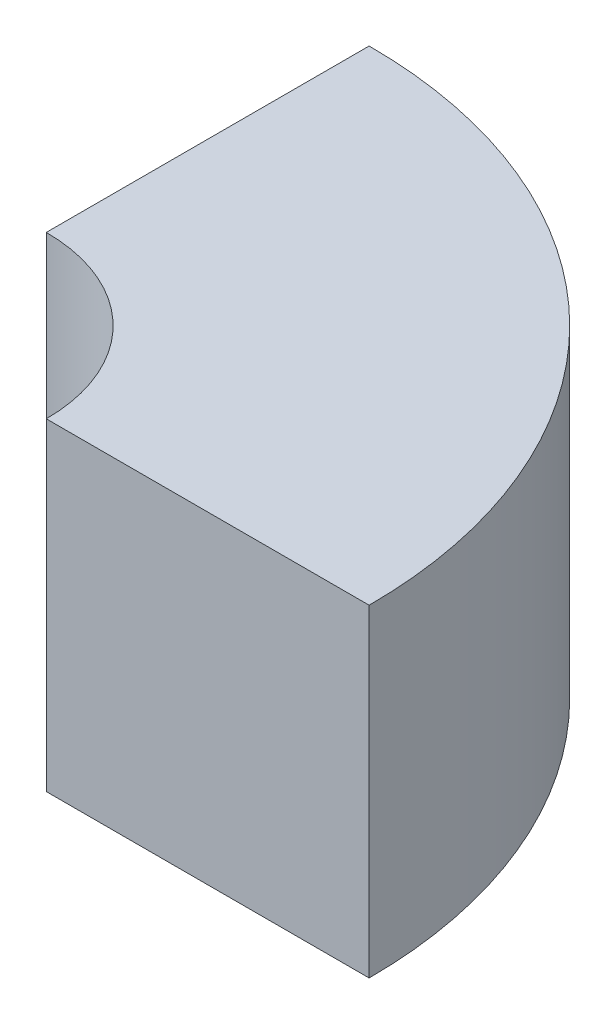
ISO-10303-21;
HEADER;
FILE_DESCRIPTION(('STEP AP214'),'2;1');
FILE_NAME('part.step','',(''),(''),'','','');
FILE_SCHEMA(('AUTOMOTIVE_DESIGN { 1 0 10303 214 1 1 1 1 }'));
ENDSEC;
DATA;
#1=APPLICATION_CONTEXT('core data for automotive mechanical design processes');
#2=APPLICATION_PROTOCOL_DEFINITION('international standard','automotive_design',2000,#1);
#3=PRODUCT_CONTEXT('',#1,'mechanical');
#4=PRODUCT('Part','Part','',(#3));
#5=PRODUCT_RELATED_PRODUCT_CATEGORY('part','',(#4));
#6=PRODUCT_DEFINITION_FORMATION('','',#4);
#7=PRODUCT_DEFINITION_CONTEXT('part definition',#1,'design');
#8=PRODUCT_DEFINITION('design','',#6,#7);
#9=PRODUCT_DEFINITION_SHAPE('','',#8);
#10=(LENGTH_UNIT() NAMED_UNIT(*) SI_UNIT(.MILLI.,.METRE.));
#11=(NAMED_UNIT(*) PLANE_ANGLE_UNIT() SI_UNIT($,.RADIAN.));
#12=(NAMED_UNIT(*) SI_UNIT($,.STERADIAN.) SOLID_ANGLE_UNIT());
#13=UNCERTAINTY_MEASURE_WITH_UNIT(LENGTH_MEASURE(1.E-05),#10,'distance_accuracy_value','');
#14=(GEOMETRIC_REPRESENTATION_CONTEXT(3) GLOBAL_UNCERTAINTY_ASSIGNED_CONTEXT((#13)) GLOBAL_UNIT_ASSIGNED_CONTEXT((#10,
#11,#12)) REPRESENTATION_CONTEXT('',''));
#15=CARTESIAN_POINT('',(0.,0.,0.));
#16=DIRECTION('',(0.,0.,1.));
#17=DIRECTION('',(1.,0.,0.));
#18=AXIS2_PLACEMENT_3D('',#15,#16,#17);
#19=CARTESIAN_POINT('',(0.,0.,0.));
#20=DIRECTION('',(0.,-1.,0.));
#21=DIRECTION('',(0.,0.,-1.));
#22=AXIS2_PLACEMENT_3D('',#19,#20,#21);
#23=CYLINDRICAL_SURFACE('',#22,5.);
#24=CARTESIAN_POINT('',(0.,10.,0.));
#25=DIRECTION('',(0.,-1.,0.));
#26=DIRECTION('',(0.,0.,-1.));
#27=AXIS2_PLACEMENT_3D('',#24,#25,#26);
#28=CIRCLE('',#27,5.);
#29=CARTESIAN_POINT('',(0.,10.,-5.));
#30=VERTEX_POINT('',#29);
#31=CARTESIAN_POINT('',(5.,10.,0.));
#32=VERTEX_POINT('',#31);
#33=EDGE_CURVE('E11',#30,#32,#28,.T.);
#34=ORIENTED_EDGE('',*,*,#33,.F.);
#35=DIRECTION('',(0.,-1.,0.));
#36=VECTOR('',#35,1.);
#37=CARTESIAN_POINT('',(0.,0.,-5.));
#38=LINE('',#37,#36);
#39=CARTESIAN_POINT('',(0.,0.,-5.));
#40=VERTEX_POINT('',#39);
#41=EDGE_CURVE('E85',#30,#40,#38,.T.);
#42=ORIENTED_EDGE('',*,*,#41,.T.);
#43=CARTESIAN_POINT('',(0.,0.,0.));
#44=DIRECTION('',(0.,-1.,0.));
#45=DIRECTION('',(0.,0.,-1.));
#46=AXIS2_PLACEMENT_3D('',#43,#44,#45);
#47=CIRCLE('',#46,5.);
#48=CARTESIAN_POINT('',(5.,0.,0.));
#49=VERTEX_POINT('',#48);
#50=EDGE_CURVE('E80',#40,#49,#47,.T.);
#51=ORIENTED_EDGE('',*,*,#50,.T.);
#52=DIRECTION('',(0.,-1.,0.));
#53=VECTOR('',#52,1.);
#54=CARTESIAN_POINT('',(5.,0.,0.));
#55=LINE('',#54,#53);
#56=EDGE_CURVE('E79',#32,#49,#55,.T.);
#57=ORIENTED_EDGE('',*,*,#56,.F.);
#58=EDGE_LOOP('',(#34,#42,#51,#57));
#59=FACE_BOUND('',#58,.T.);
#60=ADVANCED_FACE('F41',(#59),#23,.F.);
#61=CARTESIAN_POINT('',(0.,10.,-5.));
#62=DIRECTION('',(0.,1.,0.));
#63=DIRECTION('',(0.,0.,1.));
#64=AXIS2_PLACEMENT_3D('',#61,#62,#63);
#65=PLANE('',#64);
#66=CARTESIAN_POINT('',(0.,10.,0.));
#67=DIRECTION('',(0.,-1.,0.));
#68=DIRECTION('',(0.,0.,-1.));
#69=AXIS2_PLACEMENT_3D('',#66,#67,#68);
#70=CIRCLE('',#69,15.);
#71=CARTESIAN_POINT('',(0.,10.,-15.));
#72=VERTEX_POINT('',#71);
#73=CARTESIAN_POINT('',(15.,10.,0.));
#74=VERTEX_POINT('',#73);
#75=EDGE_CURVE('E47',#72,#74,#70,.T.);
#76=ORIENTED_EDGE('',*,*,#75,.F.);
#77=DIRECTION('',(0.,0.,1.));
#78=VECTOR('',#77,1.);
#79=CARTESIAN_POINT('',(0.,10.,-5.));
#80=LINE('',#79,#78);
#81=EDGE_CURVE('E87',#72,#30,#80,.T.);
#82=ORIENTED_EDGE('',*,*,#81,.T.);
#83=ORIENTED_EDGE('',*,*,#33,.T.);
#84=DIRECTION('',(-1.,0.,0.));
#85=VECTOR('',#84,1.);
#86=CARTESIAN_POINT('',(5.,10.,0.));
#87=LINE('',#86,#85);
#88=EDGE_CURVE('E97',#74,#32,#87,.T.);
#89=ORIENTED_EDGE('',*,*,#88,.F.);
#90=EDGE_LOOP('',(#76,#82,#83,#89));
#91=FACE_BOUND('',#90,.T.);
#92=ADVANCED_FACE('F43',(#91),#65,.T.);
#93=CARTESIAN_POINT('',(0.,0.,0.));
#94=DIRECTION('',(0.,-1.,0.));
#95=DIRECTION('',(0.,0.,-1.));
#96=AXIS2_PLACEMENT_3D('',#93,#94,#95);
#97=CYLINDRICAL_SURFACE('',#96,15.);
#98=CARTESIAN_POINT('',(0.,0.,0.));
#99=DIRECTION('',(0.,-1.,0.));
#100=DIRECTION('',(0.,0.,-1.));
#101=AXIS2_PLACEMENT_3D('',#98,#99,#100);
#102=CIRCLE('',#101,15.);
#103=CARTESIAN_POINT('',(0.,0.,-15.));
#104=VERTEX_POINT('',#103);
#105=CARTESIAN_POINT('',(15.,0.,0.));
#106=VERTEX_POINT('',#105);
#107=EDGE_CURVE('E88',#104,#106,#102,.T.);
#108=ORIENTED_EDGE('',*,*,#107,.F.);
#109=DIRECTION('',(0.,1.,0.));
#110=VECTOR('',#109,1.);
#111=CARTESIAN_POINT('',(0.,0.,-15.));
#112=LINE('',#111,#110);
#113=EDGE_CURVE('E110',#104,#72,#112,.T.);
#114=ORIENTED_EDGE('',*,*,#113,.T.);
#115=ORIENTED_EDGE('',*,*,#75,.T.);
#116=DIRECTION('',(0.,1.,0.));
#117=VECTOR('',#116,1.);
#118=CARTESIAN_POINT('',(15.,0.,0.));
#119=LINE('',#118,#117);
#120=EDGE_CURVE('E92',#106,#74,#119,.T.);
#121=ORIENTED_EDGE('',*,*,#120,.F.);
#122=EDGE_LOOP('',(#108,#114,#115,#121));
#123=FACE_BOUND('',#122,.T.);
#124=ADVANCED_FACE('F112',(#123),#97,.T.);
#125=CARTESIAN_POINT('',(0.,0.,-5.));
#126=DIRECTION('',(0.,-1.,0.));
#127=DIRECTION('',(0.,0.,-1.));
#128=AXIS2_PLACEMENT_3D('',#125,#126,#127);
#129=PLANE('',#128);
#130=DIRECTION('',(0.,0.,-1.));
#131=VECTOR('',#130,1.);
#132=CARTESIAN_POINT('',(0.,0.,-5.));
#133=LINE('',#132,#131);
#134=EDGE_CURVE('E104',#40,#104,#133,.T.);
#135=ORIENTED_EDGE('',*,*,#134,.T.);
#136=ORIENTED_EDGE('',*,*,#107,.T.);
#137=DIRECTION('',(1.,0.,0.));
#138=VECTOR('',#137,1.);
#139=CARTESIAN_POINT('',(5.,0.,0.));
#140=LINE('',#139,#138);
#141=EDGE_CURVE('E89',#49,#106,#140,.T.);
#142=ORIENTED_EDGE('',*,*,#141,.F.);
#143=ORIENTED_EDGE('',*,*,#50,.F.);
#144=EDGE_LOOP('',(#135,#136,#142,#143));
#145=FACE_BOUND('',#144,.T.);
#146=ADVANCED_FACE('F93',(#145),#129,.T.);
#147=CARTESIAN_POINT('',(0.,0.,0.));
#148=DIRECTION('',(-1.,0.,0.));
#149=DIRECTION('',(0.,0.,1.));
#150=AXIS2_PLACEMENT_3D('',#147,#148,#149);
#151=PLANE('',#150);
#152=ORIENTED_EDGE('',*,*,#41,.F.);
#153=ORIENTED_EDGE('',*,*,#81,.F.);
#154=ORIENTED_EDGE('',*,*,#113,.F.);
#155=ORIENTED_EDGE('',*,*,#134,.F.);
#156=EDGE_LOOP('',(#152,#153,#154,#155));
#157=FACE_BOUND('',#156,.T.);
#158=ADVANCED_FACE('F113',(#157),#151,.T.);
#159=CARTESIAN_POINT('',(0.,0.,0.));
#160=DIRECTION('',(0.,0.,-1.));
#161=DIRECTION('',(-1.,0.,0.));
#162=AXIS2_PLACEMENT_3D('',#159,#160,#161);
#163=PLANE('',#162);
#164=ORIENTED_EDGE('',*,*,#56,.T.);
#165=ORIENTED_EDGE('',*,*,#141,.T.);
#166=ORIENTED_EDGE('',*,*,#120,.T.);
#167=ORIENTED_EDGE('',*,*,#88,.T.);
#168=EDGE_LOOP('',(#164,#165,#166,#167));
#169=FACE_BOUND('',#168,.T.);
#170=ADVANCED_FACE('F98',(#169),#163,.F.);
#171=CLOSED_SHELL('',(#60,#92,#124,#146,#158,#170));
#172=MANIFOLD_SOLID_BREP('B2',#171);
#173=ADVANCED_BREP_SHAPE_REPRESENTATION('',(#18,#172),#14);
#174=SHAPE_DEFINITION_REPRESENTATION(#9,#173);
ENDSEC;
END-ISO-10303-21;
